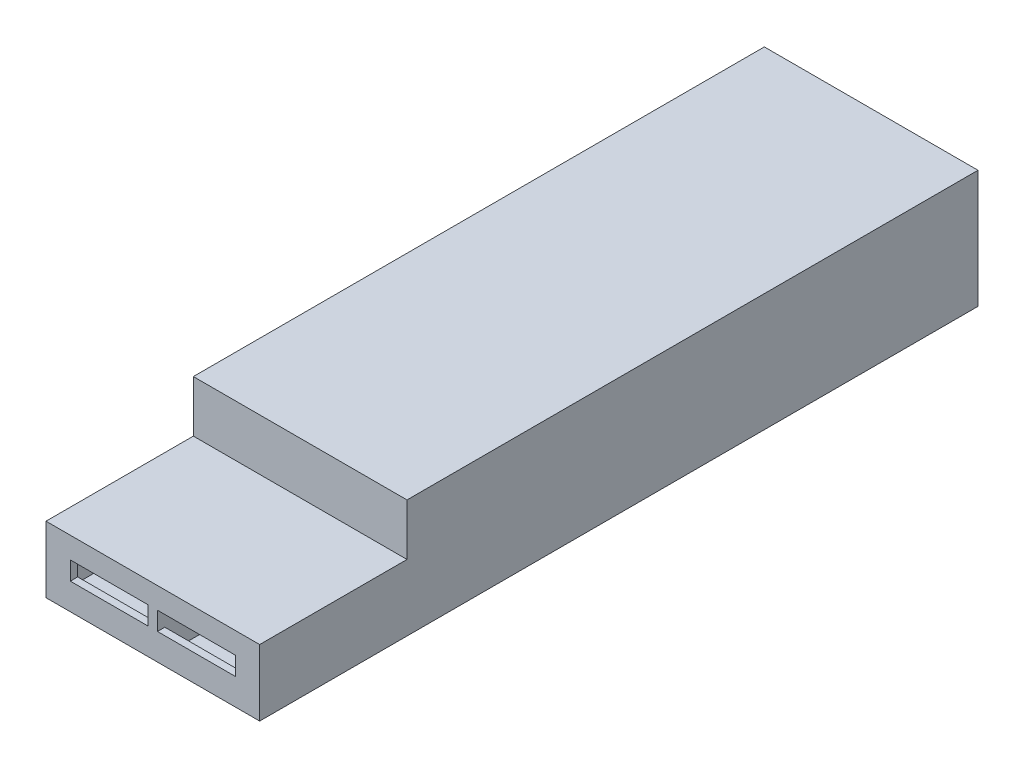
ISO-10303-21;
HEADER;
FILE_DESCRIPTION(('STEP AP214'),'2;1');
FILE_NAME('part.step','',(''),(''),'','','');
FILE_SCHEMA(('AUTOMOTIVE_DESIGN { 1 0 10303 214 1 1 1 1 }'));
ENDSEC;
DATA;
#1=APPLICATION_CONTEXT('core data for automotive mechanical design processes');
#2=APPLICATION_PROTOCOL_DEFINITION('international standard','automotive_design',2000,#1);
#3=PRODUCT_CONTEXT('',#1,'mechanical');
#4=PRODUCT('Part','Part','',(#3));
#5=PRODUCT_RELATED_PRODUCT_CATEGORY('part','',(#4));
#6=PRODUCT_DEFINITION_FORMATION('','',#4);
#7=PRODUCT_DEFINITION_CONTEXT('part definition',#1,'design');
#8=PRODUCT_DEFINITION('design','',#6,#7);
#9=PRODUCT_DEFINITION_SHAPE('','',#8);
#10=(LENGTH_UNIT() NAMED_UNIT(*) SI_UNIT(.MILLI.,.METRE.));
#11=(NAMED_UNIT(*) PLANE_ANGLE_UNIT() SI_UNIT($,.RADIAN.));
#12=(NAMED_UNIT(*) SI_UNIT($,.STERADIAN.) SOLID_ANGLE_UNIT());
#13=UNCERTAINTY_MEASURE_WITH_UNIT(LENGTH_MEASURE(1.E-05),#10,'distance_accuracy_value','');
#14=(GEOMETRIC_REPRESENTATION_CONTEXT(3) GLOBAL_UNCERTAINTY_ASSIGNED_CONTEXT((#13)) GLOBAL_UNIT_ASSIGNED_CONTEXT((#10,
#11,#12)) REPRESENTATION_CONTEXT('',''));
#15=CARTESIAN_POINT('',(0.,0.,0.));
#16=DIRECTION('',(0.,0.,1.));
#17=DIRECTION('',(1.,0.,0.));
#18=AXIS2_PLACEMENT_3D('',#15,#16,#17);
#19=CARTESIAN_POINT('',(27.5,-7.5,-1.5));
#20=DIRECTION('',(0.,-1.,0.));
#21=DIRECTION('',(0.,0.,-1.));
#22=AXIS2_PLACEMENT_3D('',#19,#20,#21);
#23=PLANE('',#22);
#24=DIRECTION('',(-1.,0.,0.));
#25=VECTOR('',#24,1.);
#26=CARTESIAN_POINT('',(27.5,-7.5,-154.5));
#27=LINE('',#26,#25);
#28=CARTESIAN_POINT('',(27.5,-7.5,-154.5));
#29=VERTEX_POINT('',#28);
#30=CARTESIAN_POINT('',(-27.5,-7.5,-154.5));
#31=VERTEX_POINT('',#30);
#32=EDGE_CURVE('E245',#29,#31,#27,.T.);
#33=ORIENTED_EDGE('',*,*,#32,.F.);
#34=DIRECTION('',(0.,0.,-1.));
#35=VECTOR('',#34,1.);
#36=CARTESIAN_POINT('',(27.5,-7.5,-1.5));
#37=LINE('',#36,#35);
#38=CARTESIAN_POINT('',(27.5,-7.5,-155.));
#39=VERTEX_POINT('',#38);
#40=EDGE_CURVE('E234',#29,#39,#37,.T.);
#41=ORIENTED_EDGE('',*,*,#40,.T.);
#42=DIRECTION('',(-1.,0.,0.));
#43=VECTOR('',#42,1.);
#44=CARTESIAN_POINT('',(27.5,-7.5,-155.));
#45=LINE('',#44,#43);
#46=CARTESIAN_POINT('',(-27.5,-7.5,-155.));
#47=VERTEX_POINT('',#46);
#48=EDGE_CURVE('E250',#39,#47,#45,.T.);
#49=ORIENTED_EDGE('',*,*,#48,.T.);
#50=DIRECTION('',(0.,0.,-1.));
#51=VECTOR('',#50,1.);
#52=CARTESIAN_POINT('',(-27.5,-7.5,-1.5));
#53=LINE('',#52,#51);
#54=EDGE_CURVE('E265',#31,#47,#53,.T.);
#55=ORIENTED_EDGE('',*,*,#54,.F.);
#56=EDGE_LOOP('',(#33,#41,#49,#55));
#57=FACE_BOUND('',#56,.T.);
#58=ADVANCED_FACE('F35',(#57),#23,.F.);
#59=CARTESIAN_POINT('',(-27.5,-8.24999999999999,-1.));
#60=DIRECTION('',(0.,1.,0.));
#61=DIRECTION('',(-1.,0.,0.));
#62=AXIS2_PLACEMENT_3D('',#59,#60,#61);
#63=PLANE('',#62);
#64=DIRECTION('',(0.,0.,1.));
#65=VECTOR('',#64,1.);
#66=CARTESIAN_POINT('',(-1.25,-8.25000000000001,20.));
#67=LINE('',#66,#65);
#68=CARTESIAN_POINT('',(-1.25,-8.25000000000001,21.25));
#69=VERTEX_POINT('',#68);
#70=CARTESIAN_POINT('',(-1.25,-8.25,38.));
#71=VERTEX_POINT('',#70);
#72=EDGE_CURVE('E276',#69,#71,#67,.T.);
#73=ORIENTED_EDGE('',*,*,#72,.F.);
#74=CARTESIAN_POINT('',(0.,-8.25,21.25));
#75=DIRECTION('',(0.,1.,0.));
#76=DIRECTION('',(-1.,0.,0.));
#77=AXIS2_PLACEMENT_3D('',#74,#75,#76);
#78=CIRCLE('',#77,1.25);
#79=CARTESIAN_POINT('',(0.,-8.25000000000001,20.));
#80=VERTEX_POINT('',#79);
#81=EDGE_CURVE('E43',#69,#80,#78,.F.);
#82=ORIENTED_EDGE('',*,*,#81,.T.);
#83=CARTESIAN_POINT('',(0.,-8.25,21.25));
#84=DIRECTION('',(0.,1.,0.));
#85=DIRECTION('',(-1.,0.,0.));
#86=AXIS2_PLACEMENT_3D('',#83,#84,#85);
#87=CIRCLE('',#86,1.25);
#88=CARTESIAN_POINT('',(1.25,-8.25000000000001,21.25));
#89=VERTEX_POINT('',#88);
#90=EDGE_CURVE('E406',#80,#89,#87,.F.);
#91=ORIENTED_EDGE('',*,*,#90,.T.);
#92=DIRECTION('',(0.,0.,1.));
#93=VECTOR('',#92,1.);
#94=CARTESIAN_POINT('',(1.25,-8.25000000000001,20.));
#95=LINE('',#94,#93);
#96=CARTESIAN_POINT('',(1.25,-8.25,38.));
#97=VERTEX_POINT('',#96);
#98=EDGE_CURVE('E278',#89,#97,#95,.T.);
#99=ORIENTED_EDGE('',*,*,#98,.T.);
#100=DIRECTION('',(-1.,0.,0.));
#101=VECTOR('',#100,1.);
#102=CARTESIAN_POINT('',(-27.5,-8.24999999999999,38.));
#103=LINE('',#102,#101);
#104=CARTESIAN_POINT('',(27.5,-8.25,38.));
#105=VERTEX_POINT('',#104);
#106=EDGE_CURVE('E225',#105,#97,#103,.T.);
#107=ORIENTED_EDGE('',*,*,#106,.F.);
#108=DIRECTION('',(0.,0.,1.));
#109=VECTOR('',#108,1.);
#110=CARTESIAN_POINT('',(27.5,-8.25,-1.));
#111=LINE('',#110,#109);
#112=CARTESIAN_POINT('',(27.5,-8.25,-154.5));
#113=VERTEX_POINT('',#112);
#114=EDGE_CURVE('E217',#113,#105,#111,.T.);
#115=ORIENTED_EDGE('',*,*,#114,.F.);
#116=DIRECTION('',(1.,0.,0.));
#117=VECTOR('',#116,1.);
#118=CARTESIAN_POINT('',(-27.5,-8.24999999999999,-154.5));
#119=LINE('',#118,#117);
#120=CARTESIAN_POINT('',(-27.5,-8.24999999999999,-154.5));
#121=VERTEX_POINT('',#120);
#122=EDGE_CURVE('E223',#121,#113,#119,.T.);
#123=ORIENTED_EDGE('',*,*,#122,.F.);
#124=DIRECTION('',(0.,0.,1.));
#125=VECTOR('',#124,1.);
#126=CARTESIAN_POINT('',(-27.5,-8.24999999999999,-1.));
#127=LINE('',#126,#125);
#128=CARTESIAN_POINT('',(-27.5,-8.24999999999999,38.));
#129=VERTEX_POINT('',#128);
#130=EDGE_CURVE('E228',#121,#129,#127,.T.);
#131=ORIENTED_EDGE('',*,*,#130,.T.);
#132=EDGE_CURVE('E282',#71,#129,#103,.T.);
#133=ORIENTED_EDGE('',*,*,#132,.F.);
#134=EDGE_LOOP('',(#73,#82,#91,#99,#107,#115,#123,#131,#133));
#135=FACE_BOUND('',#134,.T.);
#136=ADVANCED_FACE('F220',(#135),#63,.T.);
#137=CARTESIAN_POINT('',(-27.5,8.25000000000001,-1.));
#138=DIRECTION('',(0.,-1.,0.));
#139=DIRECTION('',(1.,0.,0.));
#140=AXIS2_PLACEMENT_3D('',#137,#138,#139);
#141=PLANE('',#140);
#142=DIRECTION('',(1.,0.,0.));
#143=VECTOR('',#142,1.);
#144=CARTESIAN_POINT('',(-27.5,8.25000000000001,38.));
#145=LINE('',#144,#143);
#146=CARTESIAN_POINT('',(1.25,8.25,38.));
#147=VERTEX_POINT('',#146);
#148=CARTESIAN_POINT('',(27.5,8.25,38.));
#149=VERTEX_POINT('',#148);
#150=EDGE_CURVE('E286',#147,#149,#145,.T.);
#151=ORIENTED_EDGE('',*,*,#150,.F.);
#152=DIRECTION('',(0.,0.,1.));
#153=VECTOR('',#152,1.);
#154=CARTESIAN_POINT('',(1.25,8.25000000000001,20.));
#155=LINE('',#154,#153);
#156=CARTESIAN_POINT('',(1.25,8.25000000000001,21.25));
#157=VERTEX_POINT('',#156);
#158=EDGE_CURVE('E272',#157,#147,#155,.T.);
#159=ORIENTED_EDGE('',*,*,#158,.F.);
#160=CARTESIAN_POINT('',(0.,8.25,21.25));
#161=DIRECTION('',(0.,-1.,0.));
#162=DIRECTION('',(1.,0.,0.));
#163=AXIS2_PLACEMENT_3D('',#160,#161,#162);
#164=CIRCLE('',#163,1.25);
#165=CARTESIAN_POINT('',(0.,8.25000000000001,20.));
#166=VERTEX_POINT('',#165);
#167=EDGE_CURVE('E408',#157,#166,#164,.F.);
#168=ORIENTED_EDGE('',*,*,#167,.T.);
#169=CARTESIAN_POINT('',(0.,8.25,21.25));
#170=DIRECTION('',(0.,-1.,0.));
#171=DIRECTION('',(1.,0.,0.));
#172=AXIS2_PLACEMENT_3D('',#169,#170,#171);
#173=CIRCLE('',#172,1.25);
#174=CARTESIAN_POINT('',(-1.25,8.25000000000001,21.25));
#175=VERTEX_POINT('',#174);
#176=EDGE_CURVE('E410',#166,#175,#173,.F.);
#177=ORIENTED_EDGE('',*,*,#176,.T.);
#178=DIRECTION('',(0.,0.,1.));
#179=VECTOR('',#178,1.);
#180=CARTESIAN_POINT('',(-1.25,8.25000000000001,20.));
#181=LINE('',#180,#179);
#182=CARTESIAN_POINT('',(-1.25,8.25000000000001,38.));
#183=VERTEX_POINT('',#182);
#184=EDGE_CURVE('E274',#175,#183,#181,.T.);
#185=ORIENTED_EDGE('',*,*,#184,.T.);
#186=CARTESIAN_POINT('',(-27.5,8.25000000000001,38.));
#187=VERTEX_POINT('',#186);
#188=EDGE_CURVE('E287',#187,#183,#145,.T.);
#189=ORIENTED_EDGE('',*,*,#188,.F.);
#190=DIRECTION('',(0.,0.,1.));
#191=VECTOR('',#190,1.);
#192=CARTESIAN_POINT('',(-27.5,8.25000000000001,-1.));
#193=LINE('',#192,#191);
#194=CARTESIAN_POINT('',(-27.5,8.25000000000001,-1.5));
#195=VERTEX_POINT('',#194);
#196=EDGE_CURVE('E291',#195,#187,#193,.T.);
#197=ORIENTED_EDGE('',*,*,#196,.F.);
#198=DIRECTION('',(-1.,0.,0.));
#199=VECTOR('',#198,1.);
#200=CARTESIAN_POINT('',(0.,8.25,-1.5));
#201=LINE('',#200,#199);
#202=CARTESIAN_POINT('',(27.5,8.24999999999999,-1.5));
#203=VERTEX_POINT('',#202);
#204=EDGE_CURVE('E11',#203,#195,#201,.T.);
#205=ORIENTED_EDGE('',*,*,#204,.F.);
#206=DIRECTION('',(0.,0.,1.));
#207=VECTOR('',#206,1.);
#208=CARTESIAN_POINT('',(27.5,8.25,-1.));
#209=LINE('',#208,#207);
#210=EDGE_CURVE('E50',#203,#149,#209,.T.);
#211=ORIENTED_EDGE('',*,*,#210,.T.);
#212=EDGE_LOOP('',(#151,#159,#168,#177,#185,#189,#197,#205,#211));
#213=FACE_BOUND('',#212,.T.);
#214=ADVANCED_FACE('F425',(#213),#141,.T.);
#215=CARTESIAN_POINT('',(0.,0.,38.));
#216=DIRECTION('',(0.,0.,1.));
#217=DIRECTION('',(1.,0.,0.));
#218=AXIS2_PLACEMENT_3D('',#215,#216,#217);
#219=PLANE('',#218);
#220=DIRECTION('',(0.,-1.,0.));
#221=VECTOR('',#220,1.);
#222=CARTESIAN_POINT('',(1.25,0.,38.));
#223=LINE('',#222,#221);
#224=CARTESIAN_POINT('',(1.25,3.2,38.));
#225=VERTEX_POINT('',#224);
#226=EDGE_CURVE('E400',#147,#225,#223,.T.);
#227=ORIENTED_EDGE('',*,*,#226,.F.);
#228=ORIENTED_EDGE('',*,*,#150,.T.);
#229=DIRECTION('',(0.,-1.,0.));
#230=VECTOR('',#229,1.);
#231=CARTESIAN_POINT('',(27.5,8.25,38.));
#232=LINE('',#231,#230);
#233=EDGE_CURVE('E280',#149,#105,#232,.T.);
#234=ORIENTED_EDGE('',*,*,#233,.T.);
#235=ORIENTED_EDGE('',*,*,#106,.T.);
#236=CARTESIAN_POINT('',(1.25,-1.8,38.));
#237=VERTEX_POINT('',#236);
#238=EDGE_CURVE('E397',#237,#97,#223,.T.);
#239=ORIENTED_EDGE('',*,*,#238,.F.);
#240=DIRECTION('',(1.,0.,0.));
#241=VECTOR('',#240,1.);
#242=CARTESIAN_POINT('',(1.25,-1.8,38.));
#243=LINE('',#242,#241);
#244=CARTESIAN_POINT('',(22.4,-1.8,38.));
#245=VERTEX_POINT('',#244);
#246=EDGE_CURVE('E227',#237,#245,#243,.T.);
#247=ORIENTED_EDGE('',*,*,#246,.T.);
#248=DIRECTION('',(0.,1.,0.));
#249=VECTOR('',#248,1.);
#250=CARTESIAN_POINT('',(22.4,3.2,38.));
#251=LINE('',#250,#249);
#252=CARTESIAN_POINT('',(22.4,3.2,38.));
#253=VERTEX_POINT('',#252);
#254=EDGE_CURVE('E391',#245,#253,#251,.T.);
#255=ORIENTED_EDGE('',*,*,#254,.T.);
#256=DIRECTION('',(-1.,0.,0.));
#257=VECTOR('',#256,1.);
#258=CARTESIAN_POINT('',(1.25,3.2,38.));
#259=LINE('',#258,#257);
#260=EDGE_CURVE('E296',#253,#225,#259,.T.);
#261=ORIENTED_EDGE('',*,*,#260,.T.);
#262=EDGE_LOOP('',(#227,#228,#234,#235,#239,#247,#255,#261));
#263=FACE_BOUND('',#262,.T.);
#264=ADVANCED_FACE('F481',(#263),#219,.F.);
#265=DIRECTION('',(0.,1.,0.));
#266=VECTOR('',#265,1.);
#267=CARTESIAN_POINT('',(-1.25,0.,38.));
#268=LINE('',#267,#266);
#269=CARTESIAN_POINT('',(-1.25,-1.8,38.));
#270=VERTEX_POINT('',#269);
#271=EDGE_CURVE('E396',#71,#270,#268,.T.);
#272=ORIENTED_EDGE('',*,*,#271,.F.);
#273=ORIENTED_EDGE('',*,*,#132,.T.);
#274=DIRECTION('',(0.,1.,0.));
#275=VECTOR('',#274,1.);
#276=CARTESIAN_POINT('',(-27.5,8.25000000000001,38.));
#277=LINE('',#276,#275);
#278=EDGE_CURVE('E284',#129,#187,#277,.T.);
#279=ORIENTED_EDGE('',*,*,#278,.T.);
#280=ORIENTED_EDGE('',*,*,#188,.T.);
#281=CARTESIAN_POINT('',(-1.25,3.2,38.));
#282=VERTEX_POINT('',#281);
#283=EDGE_CURVE('E393',#282,#183,#268,.T.);
#284=ORIENTED_EDGE('',*,*,#283,.F.);
#285=DIRECTION('',(-1.,0.,0.));
#286=VECTOR('',#285,1.);
#287=CARTESIAN_POINT('',(-22.4,3.2,38.));
#288=LINE('',#287,#286);
#289=CARTESIAN_POINT('',(-22.4,3.2,38.));
#290=VERTEX_POINT('',#289);
#291=EDGE_CURVE('E298',#282,#290,#288,.T.);
#292=ORIENTED_EDGE('',*,*,#291,.T.);
#293=DIRECTION('',(0.,-1.,0.));
#294=VECTOR('',#293,1.);
#295=CARTESIAN_POINT('',(-22.4,3.2,38.));
#296=LINE('',#295,#294);
#297=CARTESIAN_POINT('',(-22.4,-1.8,38.));
#298=VERTEX_POINT('',#297);
#299=EDGE_CURVE('E302',#290,#298,#296,.T.);
#300=ORIENTED_EDGE('',*,*,#299,.T.);
#301=DIRECTION('',(1.,0.,0.));
#302=VECTOR('',#301,1.);
#303=CARTESIAN_POINT('',(-22.4,-1.8,38.));
#304=LINE('',#303,#302);
#305=EDGE_CURVE('E300',#298,#270,#304,.T.);
#306=ORIENTED_EDGE('',*,*,#305,.T.);
#307=EDGE_LOOP('',(#272,#273,#279,#280,#284,#292,#300,#306));
#308=FACE_BOUND('',#307,.T.);
#309=ADVANCED_FACE('F433',(#308),#219,.F.);
#310=CARTESIAN_POINT('',(0.,0.,40.));
#311=DIRECTION('',(0.,0.,1.));
#312=DIRECTION('',(1.,0.,0.));
#313=AXIS2_PLACEMENT_3D('',#310,#311,#312);
#314=PLANE('',#313);
#315=DIRECTION('',(0.,-1.,0.));
#316=VECTOR('',#315,1.);
#317=CARTESIAN_POINT('',(1.25,3.2,40.));
#318=LINE('',#317,#316);
#319=CARTESIAN_POINT('',(1.25,3.2,40.));
#320=VERTEX_POINT('',#319);
#321=CARTESIAN_POINT('',(1.25,-1.8,40.));
#322=VERTEX_POINT('',#321);
#323=EDGE_CURVE('E329',#320,#322,#318,.T.);
#324=ORIENTED_EDGE('',*,*,#323,.F.);
#325=DIRECTION('',(-1.,0.,0.));
#326=VECTOR('',#325,1.);
#327=CARTESIAN_POINT('',(1.25,3.2,40.));
#328=LINE('',#327,#326);
#329=CARTESIAN_POINT('',(22.4,3.2,40.));
#330=VERTEX_POINT('',#329);
#331=EDGE_CURVE('E327',#330,#320,#328,.T.);
#332=ORIENTED_EDGE('',*,*,#331,.F.);
#333=DIRECTION('',(0.,1.,0.));
#334=VECTOR('',#333,1.);
#335=CARTESIAN_POINT('',(22.4,3.2,40.));
#336=LINE('',#335,#334);
#337=CARTESIAN_POINT('',(22.4,-1.8,40.));
#338=VERTEX_POINT('',#337);
#339=EDGE_CURVE('E334',#338,#330,#336,.T.);
#340=ORIENTED_EDGE('',*,*,#339,.F.);
#341=DIRECTION('',(1.,0.,0.));
#342=VECTOR('',#341,1.);
#343=CARTESIAN_POINT('',(1.25,-1.8,40.));
#344=LINE('',#343,#342);
#345=EDGE_CURVE('E331',#322,#338,#344,.T.);
#346=ORIENTED_EDGE('',*,*,#345,.F.);
#347=EDGE_LOOP('',(#324,#332,#340,#346));
#348=FACE_BOUND('',#347,.T.);
#349=DIRECTION('',(0.,1.,0.));
#350=VECTOR('',#349,1.);
#351=CARTESIAN_POINT('',(-1.25,3.2,40.));
#352=LINE('',#351,#350);
#353=CARTESIAN_POINT('',(-1.25,-1.8,40.));
#354=VERTEX_POINT('',#353);
#355=CARTESIAN_POINT('',(-1.25,3.2,40.));
#356=VERTEX_POINT('',#355);
#357=EDGE_CURVE('E352',#354,#356,#352,.T.);
#358=ORIENTED_EDGE('',*,*,#357,.F.);
#359=DIRECTION('',(1.,0.,0.));
#360=VECTOR('',#359,1.);
#361=CARTESIAN_POINT('',(-22.4,-1.8,40.));
#362=LINE('',#361,#360);
#363=CARTESIAN_POINT('',(-22.4,-1.8,40.));
#364=VERTEX_POINT('',#363);
#365=EDGE_CURVE('E350',#364,#354,#362,.T.);
#366=ORIENTED_EDGE('',*,*,#365,.F.);
#367=DIRECTION('',(0.,-1.,0.));
#368=VECTOR('',#367,1.);
#369=CARTESIAN_POINT('',(-22.4,3.2,40.));
#370=LINE('',#369,#368);
#371=CARTESIAN_POINT('',(-22.4,3.2,40.));
#372=VERTEX_POINT('',#371);
#373=EDGE_CURVE('E348',#372,#364,#370,.T.);
#374=ORIENTED_EDGE('',*,*,#373,.F.);
#375=DIRECTION('',(-1.,0.,0.));
#376=VECTOR('',#375,1.);
#377=CARTESIAN_POINT('',(-22.4,3.2,40.));
#378=LINE('',#377,#376);
#379=EDGE_CURVE('E355',#356,#372,#378,.T.);
#380=ORIENTED_EDGE('',*,*,#379,.F.);
#381=EDGE_LOOP('',(#358,#366,#374,#380));
#382=FACE_BOUND('',#381,.T.);
#383=DIRECTION('',(0.,1.,0.));
#384=VECTOR('',#383,1.);
#385=CARTESIAN_POINT('',(29.,9.,40.));
#386=LINE('',#385,#384);
#387=CARTESIAN_POINT('',(29.,-9.,40.));
#388=VERTEX_POINT('',#387);
#389=CARTESIAN_POINT('',(29.,9.,40.));
#390=VERTEX_POINT('',#389);
#391=EDGE_CURVE('E370',#388,#390,#386,.T.);
#392=ORIENTED_EDGE('',*,*,#391,.T.);
#393=DIRECTION('',(-1.,0.,0.));
#394=VECTOR('',#393,1.);
#395=CARTESIAN_POINT('',(-29.,9.,40.));
#396=LINE('',#395,#394);
#397=CARTESIAN_POINT('',(-29.,9.,40.));
#398=VERTEX_POINT('',#397);
#399=EDGE_CURVE('E373',#390,#398,#396,.T.);
#400=ORIENTED_EDGE('',*,*,#399,.T.);
#401=DIRECTION('',(0.,-1.,0.));
#402=VECTOR('',#401,1.);
#403=CARTESIAN_POINT('',(-29.,9.,40.));
#404=LINE('',#403,#402);
#405=CARTESIAN_POINT('',(-29.,-9.,40.));
#406=VERTEX_POINT('',#405);
#407=EDGE_CURVE('E375',#398,#406,#404,.T.);
#408=ORIENTED_EDGE('',*,*,#407,.T.);
#409=DIRECTION('',(1.,0.,0.));
#410=VECTOR('',#409,1.);
#411=CARTESIAN_POINT('',(-29.,-9.,40.));
#412=LINE('',#411,#410);
#413=EDGE_CURVE('E377',#406,#388,#412,.T.);
#414=ORIENTED_EDGE('',*,*,#413,.T.);
#415=EDGE_LOOP('',(#392,#400,#408,#414));
#416=FACE_BOUND('',#415,.T.);
#417=ADVANCED_FACE('F446',(#348,#382,#416),#314,.T.);
#418=CARTESIAN_POINT('',(29.,9.,40.));
#419=DIRECTION('',(-1.,0.,0.));
#420=DIRECTION('',(0.,-1.,0.));
#421=AXIS2_PLACEMENT_3D('',#418,#419,#420);
#422=PLANE('',#421);
#423=DIRECTION('',(0.,0.,-1.));
#424=VECTOR('',#423,1.);
#425=CARTESIAN_POINT('',(29.,-9.,40.));
#426=LINE('',#425,#424);
#427=CARTESIAN_POINT('',(29.,-9.,-155.));
#428=VERTEX_POINT('',#427);
#429=EDGE_CURVE('E379',#388,#428,#426,.T.);
#430=ORIENTED_EDGE('',*,*,#429,.T.);
#431=DIRECTION('',(0.,-1.,0.));
#432=VECTOR('',#431,1.);
#433=CARTESIAN_POINT('',(29.,-9.,-155.));
#434=LINE('',#433,#432);
#435=CARTESIAN_POINT('',(29.,23.,-155.));
#436=VERTEX_POINT('',#435);
#437=EDGE_CURVE('E305',#436,#428,#434,.T.);
#438=ORIENTED_EDGE('',*,*,#437,.F.);
#439=DIRECTION('',(0.,0.,1.));
#440=VECTOR('',#439,1.);
#441=CARTESIAN_POINT('',(29.,23.,-155.));
#442=LINE('',#441,#440);
#443=CARTESIAN_POINT('',(29.,23.,0.));
#444=VERTEX_POINT('',#443);
#445=EDGE_CURVE('E316',#436,#444,#442,.T.);
#446=ORIENTED_EDGE('',*,*,#445,.T.);
#447=DIRECTION('',(0.,-1.,0.));
#448=VECTOR('',#447,1.);
#449=CARTESIAN_POINT('',(29.,-9.,0.));
#450=LINE('',#449,#448);
#451=CARTESIAN_POINT('',(29.,9.,0.));
#452=VERTEX_POINT('',#451);
#453=EDGE_CURVE('E304',#444,#452,#450,.T.);
#454=ORIENTED_EDGE('',*,*,#453,.T.);
#455=DIRECTION('',(0.,0.,-1.));
#456=VECTOR('',#455,1.);
#457=CARTESIAN_POINT('',(29.,9.,40.));
#458=LINE('',#457,#456);
#459=EDGE_CURVE('E388',#390,#452,#458,.T.);
#460=ORIENTED_EDGE('',*,*,#459,.F.);
#461=ORIENTED_EDGE('',*,*,#391,.F.);
#462=EDGE_LOOP('',(#430,#438,#446,#454,#460,#461));
#463=FACE_BOUND('',#462,.T.);
#464=ADVANCED_FACE('F528',(#463),#422,.F.);
#465=CARTESIAN_POINT('',(-29.,9.,40.));
#466=DIRECTION('',(0.,-1.,0.));
#467=DIRECTION('',(0.,0.,-1.));
#468=AXIS2_PLACEMENT_3D('',#465,#466,#467);
#469=PLANE('',#468);
#470=DIRECTION('',(-1.,0.,0.));
#471=VECTOR('',#470,1.);
#472=CARTESIAN_POINT('',(-29.,9.,0.));
#473=LINE('',#472,#471);
#474=CARTESIAN_POINT('',(-29.,9.,0.));
#475=VERTEX_POINT('',#474);
#476=EDGE_CURVE('E369',#452,#475,#473,.T.);
#477=ORIENTED_EDGE('',*,*,#476,.T.);
#478=DIRECTION('',(0.,0.,-1.));
#479=VECTOR('',#478,1.);
#480=CARTESIAN_POINT('',(-29.,9.,40.));
#481=LINE('',#480,#479);
#482=EDGE_CURVE('E385',#398,#475,#481,.T.);
#483=ORIENTED_EDGE('',*,*,#482,.F.);
#484=ORIENTED_EDGE('',*,*,#399,.F.);
#485=ORIENTED_EDGE('',*,*,#459,.T.);
#486=EDGE_LOOP('',(#477,#483,#484,#485));
#487=FACE_BOUND('',#486,.T.);
#488=ADVANCED_FACE('F536',(#487),#469,.F.);
#489=CARTESIAN_POINT('',(-29.,9.,40.));
#490=DIRECTION('',(1.,0.,0.));
#491=DIRECTION('',(0.,1.,0.));
#492=AXIS2_PLACEMENT_3D('',#489,#490,#491);
#493=PLANE('',#492);
#494=ORIENTED_EDGE('',*,*,#482,.T.);
#495=DIRECTION('',(0.,1.,0.));
#496=VECTOR('',#495,1.);
#497=CARTESIAN_POINT('',(-29.,-9.,0.));
#498=LINE('',#497,#496);
#499=CARTESIAN_POINT('',(-29.,23.,0.));
#500=VERTEX_POINT('',#499);
#501=EDGE_CURVE('E319',#475,#500,#498,.T.);
#502=ORIENTED_EDGE('',*,*,#501,.T.);
#503=DIRECTION('',(0.,0.,1.));
#504=VECTOR('',#503,1.);
#505=CARTESIAN_POINT('',(-29.,23.,-155.));
#506=LINE('',#505,#504);
#507=CARTESIAN_POINT('',(-29.,23.,-155.));
#508=VERTEX_POINT('',#507);
#509=EDGE_CURVE('E324',#508,#500,#506,.T.);
#510=ORIENTED_EDGE('',*,*,#509,.F.);
#511=DIRECTION('',(0.,1.,0.));
#512=VECTOR('',#511,1.);
#513=CARTESIAN_POINT('',(-29.,-9.,-155.));
#514=LINE('',#513,#512);
#515=CARTESIAN_POINT('',(-29.,-9.,-155.));
#516=VERTEX_POINT('',#515);
#517=EDGE_CURVE('E312',#516,#508,#514,.T.);
#518=ORIENTED_EDGE('',*,*,#517,.F.);
#519=DIRECTION('',(0.,0.,-1.));
#520=VECTOR('',#519,1.);
#521=CARTESIAN_POINT('',(-29.,-9.,40.));
#522=LINE('',#521,#520);
#523=EDGE_CURVE('E383',#406,#516,#522,.T.);
#524=ORIENTED_EDGE('',*,*,#523,.F.);
#525=ORIENTED_EDGE('',*,*,#407,.F.);
#526=EDGE_LOOP('',(#494,#502,#510,#518,#524,#525));
#527=FACE_BOUND('',#526,.T.);
#528=ADVANCED_FACE('F532',(#527),#493,.F.);
#529=CARTESIAN_POINT('',(-29.,-9.,40.));
#530=DIRECTION('',(0.,1.,0.));
#531=DIRECTION('',(0.,0.,1.));
#532=AXIS2_PLACEMENT_3D('',#529,#530,#531);
#533=PLANE('',#532);
#534=ORIENTED_EDGE('',*,*,#523,.T.);
#535=DIRECTION('',(-1.,0.,0.));
#536=VECTOR('',#535,1.);
#537=CARTESIAN_POINT('',(29.,-9.,-155.));
#538=LINE('',#537,#536);
#539=EDGE_CURVE('E308',#428,#516,#538,.T.);
#540=ORIENTED_EDGE('',*,*,#539,.F.);
#541=ORIENTED_EDGE('',*,*,#429,.F.);
#542=ORIENTED_EDGE('',*,*,#413,.F.);
#543=EDGE_LOOP('',(#534,#540,#541,#542));
#544=FACE_BOUND('',#543,.T.);
#545=ADVANCED_FACE('F525',(#544),#533,.F.);
#546=CARTESIAN_POINT('',(-22.4,3.2,40.));
#547=DIRECTION('',(1.,0.,0.));
#548=DIRECTION('',(0.,0.,-1.));
#549=AXIS2_PLACEMENT_3D('',#546,#547,#548);
#550=PLANE('',#549);
#551=ORIENTED_EDGE('',*,*,#299,.F.);
#552=DIRECTION('',(0.,0.,-1.));
#553=VECTOR('',#552,1.);
#554=CARTESIAN_POINT('',(-22.4,3.2,40.));
#555=LINE('',#554,#553);
#556=EDGE_CURVE('E357',#372,#290,#555,.T.);
#557=ORIENTED_EDGE('',*,*,#556,.F.);
#558=ORIENTED_EDGE('',*,*,#373,.T.);
#559=DIRECTION('',(0.,0.,-1.));
#560=VECTOR('',#559,1.);
#561=CARTESIAN_POINT('',(-22.4,-1.8,40.));
#562=LINE('',#561,#560);
#563=EDGE_CURVE('E366',#364,#298,#562,.T.);
#564=ORIENTED_EDGE('',*,*,#563,.T.);
#565=EDGE_LOOP('',(#551,#557,#558,#564));
#566=FACE_BOUND('',#565,.T.);
#567=ADVANCED_FACE('F441',(#566),#550,.T.);
#568=CARTESIAN_POINT('',(-22.4,-1.8,40.));
#569=DIRECTION('',(0.,1.,0.));
#570=DIRECTION('',(0.,0.,1.));
#571=AXIS2_PLACEMENT_3D('',#568,#569,#570);
#572=PLANE('',#571);
#573=ORIENTED_EDGE('',*,*,#305,.F.);
#574=ORIENTED_EDGE('',*,*,#563,.F.);
#575=ORIENTED_EDGE('',*,*,#365,.T.);
#576=DIRECTION('',(0.,0.,-1.));
#577=VECTOR('',#576,1.);
#578=CARTESIAN_POINT('',(-1.25,-1.8,40.));
#579=LINE('',#578,#577);
#580=EDGE_CURVE('E363',#354,#270,#579,.T.);
#581=ORIENTED_EDGE('',*,*,#580,.T.);
#582=EDGE_LOOP('',(#573,#574,#575,#581));
#583=FACE_BOUND('',#582,.T.);
#584=ADVANCED_FACE('F451',(#583),#572,.T.);
#585=CARTESIAN_POINT('',(-1.25,3.2,40.));
#586=DIRECTION('',(-1.,0.,0.));
#587=DIRECTION('',(0.,-1.,0.));
#588=AXIS2_PLACEMENT_3D('',#585,#586,#587);
#589=PLANE('',#588);
#590=ORIENTED_EDGE('',*,*,#184,.F.);
#591=DIRECTION('',(0.,1.,0.));
#592=VECTOR('',#591,1.);
#593=CARTESIAN_POINT('',(-1.25,-8.25,21.25));
#594=LINE('',#593,#592);
#595=EDGE_CURVE('E404',#175,#69,#594,.F.);
#596=ORIENTED_EDGE('',*,*,#595,.T.);
#597=ORIENTED_EDGE('',*,*,#72,.T.);
#598=ORIENTED_EDGE('',*,*,#271,.T.);
#599=ORIENTED_EDGE('',*,*,#580,.F.);
#600=ORIENTED_EDGE('',*,*,#357,.T.);
#601=DIRECTION('',(0.,0.,-1.));
#602=VECTOR('',#601,1.);
#603=CARTESIAN_POINT('',(-1.25,3.2,40.));
#604=LINE('',#603,#602);
#605=EDGE_CURVE('E360',#356,#282,#604,.T.);
#606=ORIENTED_EDGE('',*,*,#605,.T.);
#607=ORIENTED_EDGE('',*,*,#283,.T.);
#608=EDGE_LOOP('',(#590,#596,#597,#598,#599,#600,#606,#607));
#609=FACE_BOUND('',#608,.T.);
#610=ADVANCED_FACE('F429',(#609),#589,.T.);
#611=CARTESIAN_POINT('',(-22.4,3.2,40.));
#612=DIRECTION('',(0.,-1.,0.));
#613=DIRECTION('',(0.,0.,-1.));
#614=AXIS2_PLACEMENT_3D('',#611,#612,#613);
#615=PLANE('',#614);
#616=ORIENTED_EDGE('',*,*,#291,.F.);
#617=ORIENTED_EDGE('',*,*,#605,.F.);
#618=ORIENTED_EDGE('',*,*,#379,.T.);
#619=ORIENTED_EDGE('',*,*,#556,.T.);
#620=EDGE_LOOP('',(#616,#617,#618,#619));
#621=FACE_BOUND('',#620,.T.);
#622=ADVANCED_FACE('F436',(#621),#615,.T.);
#623=CARTESIAN_POINT('',(1.25,3.2,40.));
#624=DIRECTION('',(0.,-1.,0.));
#625=DIRECTION('',(0.,0.,-1.));
#626=AXIS2_PLACEMENT_3D('',#623,#624,#625);
#627=PLANE('',#626);
#628=ORIENTED_EDGE('',*,*,#260,.F.);
#629=DIRECTION('',(0.,0.,-1.));
#630=VECTOR('',#629,1.);
#631=CARTESIAN_POINT('',(22.4,3.2,40.));
#632=LINE('',#631,#630);
#633=EDGE_CURVE('E336',#330,#253,#632,.T.);
#634=ORIENTED_EDGE('',*,*,#633,.F.);
#635=ORIENTED_EDGE('',*,*,#331,.T.);
#636=DIRECTION('',(0.,0.,-1.));
#637=VECTOR('',#636,1.);
#638=CARTESIAN_POINT('',(1.25,3.2,40.));
#639=LINE('',#638,#637);
#640=EDGE_CURVE('E345',#320,#225,#639,.T.);
#641=ORIENTED_EDGE('',*,*,#640,.T.);
#642=EDGE_LOOP('',(#628,#634,#635,#641));
#643=FACE_BOUND('',#642,.T.);
#644=ADVANCED_FACE('F512',(#643),#627,.T.);
#645=CARTESIAN_POINT('',(1.25,3.2,40.));
#646=DIRECTION('',(1.,0.,0.));
#647=DIRECTION('',(0.,1.,0.));
#648=AXIS2_PLACEMENT_3D('',#645,#646,#647);
#649=PLANE('',#648);
#650=ORIENTED_EDGE('',*,*,#98,.F.);
#651=DIRECTION('',(0.,-1.,0.));
#652=VECTOR('',#651,1.);
#653=CARTESIAN_POINT('',(1.25,8.25,21.25));
#654=LINE('',#653,#652);
#655=EDGE_CURVE('E401',#89,#157,#654,.F.);
#656=ORIENTED_EDGE('',*,*,#655,.T.);
#657=ORIENTED_EDGE('',*,*,#158,.T.);
#658=ORIENTED_EDGE('',*,*,#226,.T.);
#659=ORIENTED_EDGE('',*,*,#640,.F.);
#660=ORIENTED_EDGE('',*,*,#323,.T.);
#661=DIRECTION('',(0.,0.,-1.));
#662=VECTOR('',#661,1.);
#663=CARTESIAN_POINT('',(1.25,-1.8,40.));
#664=LINE('',#663,#662);
#665=EDGE_CURVE('E342',#322,#237,#664,.T.);
#666=ORIENTED_EDGE('',*,*,#665,.T.);
#667=ORIENTED_EDGE('',*,*,#238,.T.);
#668=EDGE_LOOP('',(#650,#656,#657,#658,#659,#660,#666,#667));
#669=FACE_BOUND('',#668,.T.);
#670=ADVANCED_FACE('F508',(#669),#649,.T.);
#671=CARTESIAN_POINT('',(1.25,-1.8,40.));
#672=DIRECTION('',(0.,1.,0.));
#673=DIRECTION('',(0.,0.,1.));
#674=AXIS2_PLACEMENT_3D('',#671,#672,#673);
#675=PLANE('',#674);
#676=ORIENTED_EDGE('',*,*,#246,.F.);
#677=ORIENTED_EDGE('',*,*,#665,.F.);
#678=ORIENTED_EDGE('',*,*,#345,.T.);
#679=DIRECTION('',(0.,0.,-1.));
#680=VECTOR('',#679,1.);
#681=CARTESIAN_POINT('',(22.4,-1.8,40.));
#682=LINE('',#681,#680);
#683=EDGE_CURVE('E339',#338,#245,#682,.T.);
#684=ORIENTED_EDGE('',*,*,#683,.T.);
#685=EDGE_LOOP('',(#676,#677,#678,#684));
#686=FACE_BOUND('',#685,.T.);
#687=ADVANCED_FACE('F504',(#686),#675,.T.);
#688=CARTESIAN_POINT('',(22.4,3.2,40.));
#689=DIRECTION('',(-1.,0.,0.));
#690=DIRECTION('',(0.,0.,1.));
#691=AXIS2_PLACEMENT_3D('',#688,#689,#690);
#692=PLANE('',#691);
#693=ORIENTED_EDGE('',*,*,#254,.F.);
#694=ORIENTED_EDGE('',*,*,#683,.F.);
#695=ORIENTED_EDGE('',*,*,#339,.T.);
#696=ORIENTED_EDGE('',*,*,#633,.T.);
#697=EDGE_LOOP('',(#693,#694,#695,#696));
#698=FACE_BOUND('',#697,.T.);
#699=ADVANCED_FACE('F495',(#698),#692,.T.);
#700=CARTESIAN_POINT('',(0.,0.,-155.));
#701=DIRECTION('',(0.,0.,1.));
#702=DIRECTION('',(1.,0.,0.));
#703=AXIS2_PLACEMENT_3D('',#700,#701,#702);
#704=PLANE('',#703);
#705=DIRECTION('',(1.,0.,0.));
#706=VECTOR('',#705,1.);
#707=CARTESIAN_POINT('',(27.5,21.5,-155.));
#708=LINE('',#707,#706);
#709=CARTESIAN_POINT('',(-27.5,21.5,-155.));
#710=VERTEX_POINT('',#709);
#711=CARTESIAN_POINT('',(27.5,21.5,-155.));
#712=VERTEX_POINT('',#711);
#713=EDGE_CURVE('E258',#710,#712,#708,.T.);
#714=ORIENTED_EDGE('',*,*,#713,.F.);
#715=DIRECTION('',(0.,1.,0.));
#716=VECTOR('',#715,1.);
#717=CARTESIAN_POINT('',(-27.5,-7.5,-155.));
#718=LINE('',#717,#716);
#719=EDGE_CURVE('E58',#47,#710,#718,.T.);
#720=ORIENTED_EDGE('',*,*,#719,.F.);
#721=ORIENTED_EDGE('',*,*,#48,.F.);
#722=DIRECTION('',(0.,-1.,0.));
#723=VECTOR('',#722,1.);
#724=CARTESIAN_POINT('',(27.5,-7.5,-155.));
#725=LINE('',#724,#723);
#726=EDGE_CURVE('E261',#712,#39,#725,.T.);
#727=ORIENTED_EDGE('',*,*,#726,.F.);
#728=EDGE_LOOP('',(#714,#720,#721,#727));
#729=FACE_BOUND('',#728,.T.);
#730=ORIENTED_EDGE('',*,*,#437,.T.);
#731=ORIENTED_EDGE('',*,*,#539,.T.);
#732=ORIENTED_EDGE('',*,*,#517,.T.);
#733=DIRECTION('',(1.,0.,0.));
#734=VECTOR('',#733,1.);
#735=CARTESIAN_POINT('',(29.,23.,-155.));
#736=LINE('',#735,#734);
#737=EDGE_CURVE('E314',#508,#436,#736,.T.);
#738=ORIENTED_EDGE('',*,*,#737,.T.);
#739=EDGE_LOOP('',(#730,#731,#732,#738));
#740=FACE_BOUND('',#739,.T.);
#741=ADVANCED_FACE('F466',(#729,#740),#704,.F.);
#742=CARTESIAN_POINT('',(29.,23.,-155.));
#743=DIRECTION('',(0.,-1.,0.));
#744=DIRECTION('',(0.,0.,-1.));
#745=AXIS2_PLACEMENT_3D('',#742,#743,#744);
#746=PLANE('',#745);
#747=DIRECTION('',(1.,0.,0.));
#748=VECTOR('',#747,1.);
#749=CARTESIAN_POINT('',(29.,23.,0.));
#750=LINE('',#749,#748);
#751=EDGE_CURVE('E309',#500,#444,#750,.T.);
#752=ORIENTED_EDGE('',*,*,#751,.T.);
#753=ORIENTED_EDGE('',*,*,#445,.F.);
#754=ORIENTED_EDGE('',*,*,#737,.F.);
#755=ORIENTED_EDGE('',*,*,#509,.T.);
#756=EDGE_LOOP('',(#752,#753,#754,#755));
#757=FACE_BOUND('',#756,.T.);
#758=ADVANCED_FACE('F494',(#757),#746,.F.);
#759=CARTESIAN_POINT('',(0.,0.,0.));
#760=DIRECTION('',(0.,0.,1.));
#761=DIRECTION('',(1.,0.,0.));
#762=AXIS2_PLACEMENT_3D('',#759,#760,#761);
#763=PLANE('',#762);
#764=ORIENTED_EDGE('',*,*,#476,.F.);
#765=ORIENTED_EDGE('',*,*,#453,.F.);
#766=ORIENTED_EDGE('',*,*,#751,.F.);
#767=ORIENTED_EDGE('',*,*,#501,.F.);
#768=EDGE_LOOP('',(#764,#765,#766,#767));
#769=FACE_BOUND('',#768,.T.);
#770=ADVANCED_FACE('F491',(#769),#763,.T.);
#771=CARTESIAN_POINT('',(27.5,8.25,-1.));
#772=DIRECTION('',(-1.,0.,0.));
#773=DIRECTION('',(0.,-1.,0.));
#774=AXIS2_PLACEMENT_3D('',#771,#772,#773);
#775=PLANE('',#774);
#776=ORIENTED_EDGE('',*,*,#233,.F.);
#777=ORIENTED_EDGE('',*,*,#210,.F.);
#778=DIRECTION('',(0.,-1.,0.));
#779=VECTOR('',#778,1.);
#780=CARTESIAN_POINT('',(27.5,-7.5,-1.5));
#781=LINE('',#780,#779);
#782=CARTESIAN_POINT('',(27.5,21.5,-1.5));
#783=VERTEX_POINT('',#782);
#784=EDGE_CURVE('E253',#783,#203,#781,.T.);
#785=ORIENTED_EDGE('',*,*,#784,.F.);
#786=DIRECTION('',(0.,0.,-1.));
#787=VECTOR('',#786,1.);
#788=CARTESIAN_POINT('',(27.5,21.5,-1.5));
#789=LINE('',#788,#787);
#790=EDGE_CURVE('E269',#783,#712,#789,.T.);
#791=ORIENTED_EDGE('',*,*,#790,.T.);
#792=ORIENTED_EDGE('',*,*,#726,.T.);
#793=ORIENTED_EDGE('',*,*,#40,.F.);
#794=DIRECTION('',(0.,1.,0.));
#795=VECTOR('',#794,1.);
#796=CARTESIAN_POINT('',(27.5,-8.25,-154.5));
#797=LINE('',#796,#795);
#798=EDGE_CURVE('E231',#113,#29,#797,.T.);
#799=ORIENTED_EDGE('',*,*,#798,.F.);
#800=ORIENTED_EDGE('',*,*,#114,.T.);
#801=EDGE_LOOP('',(#776,#777,#785,#791,#792,#793,#799,#800));
#802=FACE_BOUND('',#801,.T.);
#803=ADVANCED_FACE('F232',(#802),#775,.T.);
#804=CARTESIAN_POINT('',(-27.5,8.25000000000001,-1.));
#805=DIRECTION('',(1.,0.,0.));
#806=DIRECTION('',(0.,1.,0.));
#807=AXIS2_PLACEMENT_3D('',#804,#805,#806);
#808=PLANE('',#807);
#809=ORIENTED_EDGE('',*,*,#278,.F.);
#810=ORIENTED_EDGE('',*,*,#130,.F.);
#811=DIRECTION('',(0.,-1.,0.));
#812=VECTOR('',#811,1.);
#813=CARTESIAN_POINT('',(-27.5,8.25000000000001,-154.5));
#814=LINE('',#813,#812);
#815=EDGE_CURVE('E237',#31,#121,#814,.T.);
#816=ORIENTED_EDGE('',*,*,#815,.F.);
#817=ORIENTED_EDGE('',*,*,#54,.T.);
#818=ORIENTED_EDGE('',*,*,#719,.T.);
#819=DIRECTION('',(0.,0.,-1.));
#820=VECTOR('',#819,1.);
#821=CARTESIAN_POINT('',(-27.5,21.5,-1.5));
#822=LINE('',#821,#820);
#823=CARTESIAN_POINT('',(-27.5,21.5,-1.5));
#824=VERTEX_POINT('',#823);
#825=EDGE_CURVE('E256',#824,#710,#822,.T.);
#826=ORIENTED_EDGE('',*,*,#825,.F.);
#827=DIRECTION('',(0.,1.,0.));
#828=VECTOR('',#827,1.);
#829=CARTESIAN_POINT('',(-27.5,-7.5,-1.5));
#830=LINE('',#829,#828);
#831=EDGE_CURVE('E247',#195,#824,#830,.T.);
#832=ORIENTED_EDGE('',*,*,#831,.F.);
#833=ORIENTED_EDGE('',*,*,#196,.T.);
#834=EDGE_LOOP('',(#809,#810,#816,#817,#818,#826,#832,#833));
#835=FACE_BOUND('',#834,.T.);
#836=ADVANCED_FACE('F455',(#835),#808,.T.);
#837=CARTESIAN_POINT('',(0.,0.,21.25));
#838=DIRECTION('',(0.,-1.,0.));
#839=DIRECTION('',(1.,0.,0.));
#840=AXIS2_PLACEMENT_3D('',#837,#838,#839);
#841=CYLINDRICAL_SURFACE('',#840,1.25);
#842=ORIENTED_EDGE('',*,*,#595,.F.);
#843=ORIENTED_EDGE('',*,*,#176,.F.);
#844=DIRECTION('',(0.,1.,0.));
#845=VECTOR('',#844,1.);
#846=CARTESIAN_POINT('',(0.,8.25,20.));
#847=LINE('',#846,#845);
#848=EDGE_CURVE('E267',#80,#166,#847,.T.);
#849=ORIENTED_EDGE('',*,*,#848,.F.);
#850=ORIENTED_EDGE('',*,*,#81,.F.);
#851=EDGE_LOOP('',(#842,#843,#849,#850));
#852=FACE_BOUND('',#851,.T.);
#853=ADVANCED_FACE('F37',(#852),#841,.T.);
#854=CARTESIAN_POINT('',(0.,0.,21.25));
#855=DIRECTION('',(0.,1.,0.));
#856=DIRECTION('',(-1.,0.,0.));
#857=AXIS2_PLACEMENT_3D('',#854,#855,#856);
#858=CYLINDRICAL_SURFACE('',#857,1.25);
#859=ORIENTED_EDGE('',*,*,#167,.F.);
#860=ORIENTED_EDGE('',*,*,#655,.F.);
#861=ORIENTED_EDGE('',*,*,#90,.F.);
#862=ORIENTED_EDGE('',*,*,#848,.T.);
#863=EDGE_LOOP('',(#859,#860,#861,#862));
#864=FACE_BOUND('',#863,.T.);
#865=ADVANCED_FACE('F416',(#864),#858,.T.);
#866=CARTESIAN_POINT('',(27.5,21.5,-1.5));
#867=DIRECTION('',(0.,1.,0.));
#868=DIRECTION('',(0.,0.,1.));
#869=AXIS2_PLACEMENT_3D('',#866,#867,#868);
#870=PLANE('',#869);
#871=ORIENTED_EDGE('',*,*,#713,.T.);
#872=ORIENTED_EDGE('',*,*,#790,.F.);
#873=DIRECTION('',(1.,0.,0.));
#874=VECTOR('',#873,1.);
#875=CARTESIAN_POINT('',(27.5,21.5,-1.5));
#876=LINE('',#875,#874);
#877=EDGE_CURVE('E249',#824,#783,#876,.T.);
#878=ORIENTED_EDGE('',*,*,#877,.F.);
#879=ORIENTED_EDGE('',*,*,#825,.T.);
#880=EDGE_LOOP('',(#871,#872,#878,#879));
#881=FACE_BOUND('',#880,.T.);
#882=ADVANCED_FACE('F464',(#881),#870,.F.);
#883=CARTESIAN_POINT('',(0.,0.,-1.5));
#884=DIRECTION('',(0.,0.,1.));
#885=DIRECTION('',(1.,0.,0.));
#886=AXIS2_PLACEMENT_3D('',#883,#884,#885);
#887=PLANE('',#886);
#888=ORIENTED_EDGE('',*,*,#784,.T.);
#889=ORIENTED_EDGE('',*,*,#204,.T.);
#890=ORIENTED_EDGE('',*,*,#831,.T.);
#891=ORIENTED_EDGE('',*,*,#877,.T.);
#892=EDGE_LOOP('',(#888,#889,#890,#891));
#893=FACE_BOUND('',#892,.T.);
#894=ADVANCED_FACE('F458',(#893),#887,.F.);
#895=CARTESIAN_POINT('',(0.,0.,-154.5));
#896=DIRECTION('',(0.,0.,1.));
#897=DIRECTION('',(1.,0.,0.));
#898=AXIS2_PLACEMENT_3D('',#895,#896,#897);
#899=PLANE('',#898);
#900=ORIENTED_EDGE('',*,*,#32,.T.);
#901=ORIENTED_EDGE('',*,*,#815,.T.);
#902=ORIENTED_EDGE('',*,*,#122,.T.);
#903=ORIENTED_EDGE('',*,*,#798,.T.);
#904=EDGE_LOOP('',(#900,#901,#902,#903));
#905=FACE_BOUND('',#904,.T.);
#906=ADVANCED_FACE('F240',(#905),#899,.T.);
#907=CLOSED_SHELL('',(#58,#136,#214,#264,#309,#417,#464,#488,#528,#545,#567,#584,#610,#622,#644,
#670,#687,#699,#741,#758,#770,#803,#836,#853,#865,#882,#894,#906));
#908=MANIFOLD_SOLID_BREP('B2',#907);
#909=ADVANCED_BREP_SHAPE_REPRESENTATION('',(#18,#908),#14);
#910=SHAPE_DEFINITION_REPRESENTATION(#9,#909);
ENDSEC;
END-ISO-10303-21;
